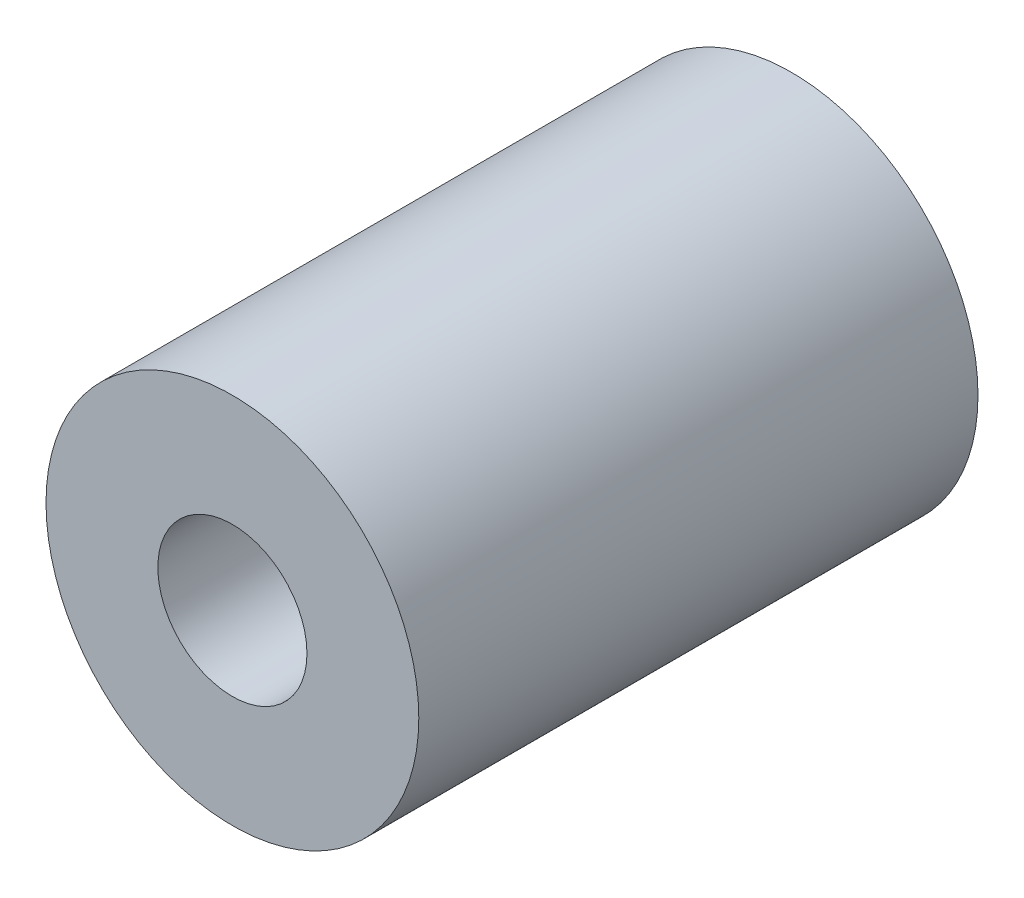
ISO-10303-21;
HEADER;
FILE_DESCRIPTION(('STEP AP214'),'2;1');
FILE_NAME('part.step','',(''),(''),'','','');
FILE_SCHEMA(('AUTOMOTIVE_DESIGN { 1 0 10303 214 1 1 1 1 }'));
ENDSEC;
DATA;
#1=APPLICATION_CONTEXT('core data for automotive mechanical design processes');
#2=APPLICATION_PROTOCOL_DEFINITION('international standard','automotive_design',2000,#1);
#3=PRODUCT_CONTEXT('',#1,'mechanical');
#4=PRODUCT('Part','Part','',(#3));
#5=PRODUCT_RELATED_PRODUCT_CATEGORY('part','',(#4));
#6=PRODUCT_DEFINITION_FORMATION('','',#4);
#7=PRODUCT_DEFINITION_CONTEXT('part definition',#1,'design');
#8=PRODUCT_DEFINITION('design','',#6,#7);
#9=PRODUCT_DEFINITION_SHAPE('','',#8);
#10=(LENGTH_UNIT() NAMED_UNIT(*) SI_UNIT(.MILLI.,.METRE.));
#11=(NAMED_UNIT(*) PLANE_ANGLE_UNIT() SI_UNIT($,.RADIAN.));
#12=(NAMED_UNIT(*) SI_UNIT($,.STERADIAN.) SOLID_ANGLE_UNIT());
#13=UNCERTAINTY_MEASURE_WITH_UNIT(LENGTH_MEASURE(1.E-05),#10,'distance_accuracy_value','');
#14=(GEOMETRIC_REPRESENTATION_CONTEXT(3) GLOBAL_UNCERTAINTY_ASSIGNED_CONTEXT((#13)) GLOBAL_UNIT_ASSIGNED_CONTEXT((#10,
#11,#12)) REPRESENTATION_CONTEXT('',''));
#15=CARTESIAN_POINT('',(0.,0.,0.));
#16=DIRECTION('',(0.,0.,1.));
#17=DIRECTION('',(1.,0.,0.));
#18=AXIS2_PLACEMENT_3D('',#15,#16,#17);
#19=CARTESIAN_POINT('',(0.,0.,30.));
#20=DIRECTION('',(0.,0.,-1.));
#21=DIRECTION('',(-1.,0.,0.));
#22=AXIS2_PLACEMENT_3D('',#19,#20,#21);
#23=CYLINDRICAL_SURFACE('',#22,10.);
#24=CARTESIAN_POINT('',(0.,0.,30.));
#25=DIRECTION('',(0.,0.,1.));
#26=DIRECTION('',(1.,0.,0.));
#27=AXIS2_PLACEMENT_3D('',#24,#25,#26);
#28=CIRCLE('',#27,10.);
#29=CARTESIAN_POINT('',(10.,0.,30.));
#30=VERTEX_POINT('',#29);
#31=EDGE_CURVE('E10',#30,#30,#28,.T.);
#32=ORIENTED_EDGE('',*,*,#31,.F.);
#33=EDGE_LOOP('',(#32));
#34=FACE_BOUND('',#33,.T.);
#35=CARTESIAN_POINT('',(0.,0.,0.));
#36=DIRECTION('',(0.,0.,1.));
#37=DIRECTION('',(1.,0.,0.));
#38=AXIS2_PLACEMENT_3D('',#35,#36,#37);
#39=CIRCLE('',#38,10.);
#40=CARTESIAN_POINT('',(10.,0.,0.));
#41=VERTEX_POINT('',#40);
#42=EDGE_CURVE('E33',#41,#41,#39,.T.);
#43=ORIENTED_EDGE('',*,*,#42,.T.);
#44=EDGE_LOOP('',(#43));
#45=FACE_BOUND('',#44,.T.);
#46=ADVANCED_FACE('F30',(#34,#45),#23,.T.);
#47=CARTESIAN_POINT('',(0.,0.,30.));
#48=DIRECTION('',(0.,0.,1.));
#49=DIRECTION('',(1.,0.,0.));
#50=AXIS2_PLACEMENT_3D('',#47,#48,#49);
#51=PLANE('',#50);
#52=CARTESIAN_POINT('',(0.,0.,30.));
#53=DIRECTION('',(0.,0.,1.));
#54=DIRECTION('',(1.,0.,0.));
#55=AXIS2_PLACEMENT_3D('',#52,#53,#54);
#56=CIRCLE('',#55,4.);
#57=CARTESIAN_POINT('',(4.,0.,30.));
#58=VERTEX_POINT('',#57);
#59=EDGE_CURVE('E42',#58,#58,#56,.T.);
#60=ORIENTED_EDGE('',*,*,#59,.F.);
#61=EDGE_LOOP('',(#60));
#62=FACE_BOUND('',#61,.T.);
#63=ORIENTED_EDGE('',*,*,#31,.T.);
#64=EDGE_LOOP('',(#63));
#65=FACE_BOUND('',#64,.T.);
#66=ADVANCED_FACE('F57',(#62,#65),#51,.T.);
#67=CARTESIAN_POINT('',(0.,0.,0.));
#68=DIRECTION('',(0.,0.,1.));
#69=DIRECTION('',(1.,0.,0.));
#70=AXIS2_PLACEMENT_3D('',#67,#68,#69);
#71=PLANE('',#70);
#72=CARTESIAN_POINT('',(0.,0.,0.));
#73=DIRECTION('',(0.,0.,1.));
#74=DIRECTION('',(1.,0.,0.));
#75=AXIS2_PLACEMENT_3D('',#72,#73,#74);
#76=CIRCLE('',#75,4.);
#77=CARTESIAN_POINT('',(4.,0.,0.));
#78=VERTEX_POINT('',#77);
#79=EDGE_CURVE('E40',#78,#78,#76,.T.);
#80=ORIENTED_EDGE('',*,*,#79,.T.);
#81=EDGE_LOOP('',(#80));
#82=FACE_BOUND('',#81,.T.);
#83=ORIENTED_EDGE('',*,*,#42,.F.);
#84=EDGE_LOOP('',(#83));
#85=FACE_BOUND('',#84,.T.);
#86=ADVANCED_FACE('F48',(#82,#85),#71,.F.);
#87=CARTESIAN_POINT('',(0.,0.,0.));
#88=DIRECTION('',(0.,0.,1.));
#89=DIRECTION('',(1.,0.,0.));
#90=AXIS2_PLACEMENT_3D('',#87,#88,#89);
#91=CYLINDRICAL_SURFACE('',#90,4.);
#92=ORIENTED_EDGE('',*,*,#79,.F.);
#93=EDGE_LOOP('',(#92));
#94=FACE_BOUND('',#93,.T.);
#95=ORIENTED_EDGE('',*,*,#59,.T.);
#96=EDGE_LOOP('',(#95));
#97=FACE_BOUND('',#96,.T.);
#98=ADVANCED_FACE('F51',(#94,#97),#91,.F.);
#99=CLOSED_SHELL('',(#46,#66,#86,#98));
#100=MANIFOLD_SOLID_BREP('B2',#99);
#101=ADVANCED_BREP_SHAPE_REPRESENTATION('',(#18,#100),#14);
#102=SHAPE_DEFINITION_REPRESENTATION(#9,#101);
ENDSEC;
END-ISO-10303-21;
